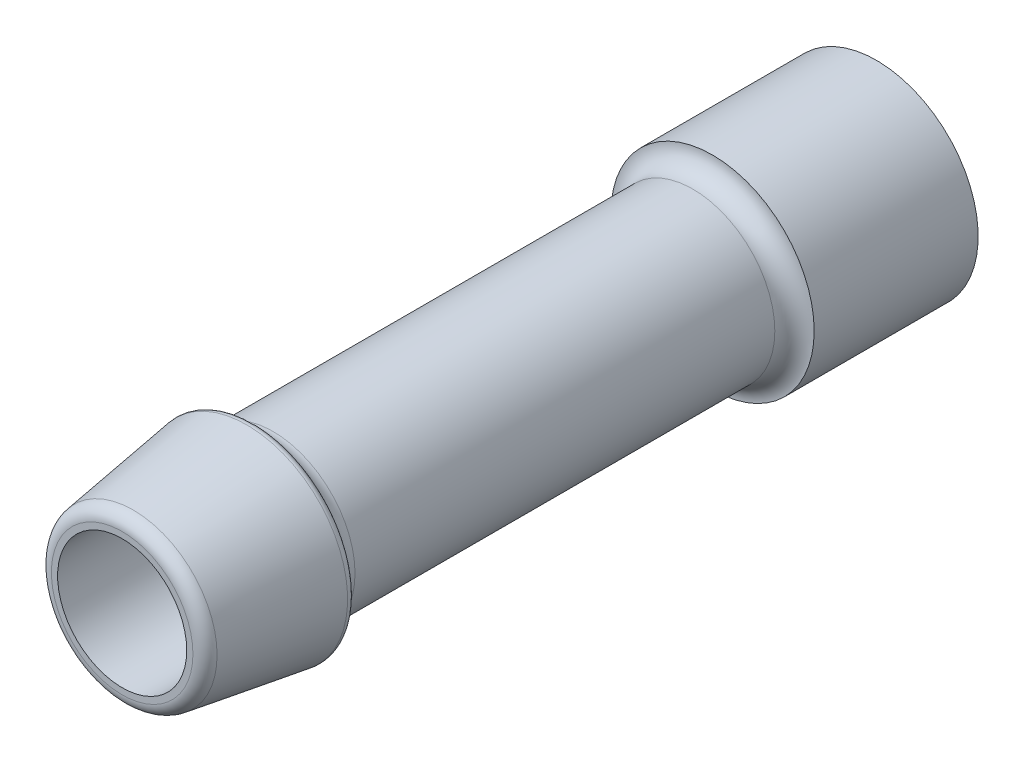
ISO-10303-21;
HEADER;
FILE_DESCRIPTION(('STEP AP214'),'2;1');
FILE_NAME('part.step','',(''),(''),'','','');
FILE_SCHEMA(('AUTOMOTIVE_DESIGN { 1 0 10303 214 1 1 1 1 }'));
ENDSEC;
DATA;
#1=APPLICATION_CONTEXT('core data for automotive mechanical design processes');
#2=APPLICATION_PROTOCOL_DEFINITION('international standard','automotive_design',2000,#1);
#3=PRODUCT_CONTEXT('',#1,'mechanical');
#4=PRODUCT('Part','Part','',(#3));
#5=PRODUCT_RELATED_PRODUCT_CATEGORY('part','',(#4));
#6=PRODUCT_DEFINITION_FORMATION('','',#4);
#7=PRODUCT_DEFINITION_CONTEXT('part definition',#1,'design');
#8=PRODUCT_DEFINITION('design','',#6,#7);
#9=PRODUCT_DEFINITION_SHAPE('','',#8);
#10=(LENGTH_UNIT() NAMED_UNIT(*) SI_UNIT(.MILLI.,.METRE.));
#11=(NAMED_UNIT(*) PLANE_ANGLE_UNIT() SI_UNIT($,.RADIAN.));
#12=(NAMED_UNIT(*) SI_UNIT($,.STERADIAN.) SOLID_ANGLE_UNIT());
#13=UNCERTAINTY_MEASURE_WITH_UNIT(LENGTH_MEASURE(1.E-05),#10,'distance_accuracy_value','');
#14=(GEOMETRIC_REPRESENTATION_CONTEXT(3) GLOBAL_UNCERTAINTY_ASSIGNED_CONTEXT((#13)) GLOBAL_UNIT_ASSIGNED_CONTEXT((#10,
#11,#12)) REPRESENTATION_CONTEXT('',''));
#15=CARTESIAN_POINT('',(0.,0.,0.));
#16=DIRECTION('',(0.,0.,1.));
#17=DIRECTION('',(1.,0.,0.));
#18=AXIS2_PLACEMENT_3D('',#15,#16,#17);
#19=CARTESIAN_POINT('',(0.,0.,29.21));
#20=DIRECTION('',(0.,0.,-1.));
#21=DIRECTION('',(-1.,0.,0.));
#22=AXIS2_PLACEMENT_3D('',#19,#20,#21);
#23=CYLINDRICAL_SURFACE('',#22,3.937);
#24=CARTESIAN_POINT('',(0.,0.,0.));
#25=DIRECTION('',(0.,0.,1.));
#26=DIRECTION('',(1.,0.,0.));
#27=AXIS2_PLACEMENT_3D('',#24,#25,#26);
#28=CIRCLE('',#27,3.937);
#29=CARTESIAN_POINT('',(-3.937,0.,0.));
#30=VERTEX_POINT('',#29);
#31=EDGE_CURVE('E71',#30,#30,#28,.T.);
#32=CARTESIAN_POINT('',(0.,0.,6.35));
#33=DIRECTION('',(0.,0.,1.));
#34=DIRECTION('',(1.,0.,0.));
#35=AXIS2_PLACEMENT_3D('',#32,#33,#34);
#36=CIRCLE('',#35,3.937);
#37=CARTESIAN_POINT('',(-3.937,0.,6.34999999999999));
#38=VERTEX_POINT('',#37);
#39=EDGE_CURVE('E72',#38,#38,#36,.T.);
#40=CARTESIAN_POINT('',(-3.937,0.,0.));
#41=CARTESIAN_POINT('',(-3.937,0.,0.066145833333333));
#42=CARTESIAN_POINT('',(-3.937,0.,0.132291666666666));
#43=CARTESIAN_POINT('',(-3.937,0.,0.264583333333332));
#44=CARTESIAN_POINT('',(-3.937,0.,0.330729166666665));
#45=CARTESIAN_POINT('',(-3.937,0.,0.463020833333332));
#46=CARTESIAN_POINT('',(-3.937,0.,0.529166666666666));
#47=CARTESIAN_POINT('',(-3.937,0.,0.661458333333333));
#48=CARTESIAN_POINT('',(-3.937,0.,0.727604166666666));
#49=CARTESIAN_POINT('',(-3.937,0.,0.859895833333332));
#50=CARTESIAN_POINT('',(-3.937,0.,0.926041666666665));
#51=CARTESIAN_POINT('',(-3.937,0.,1.05833333333333));
#52=CARTESIAN_POINT('',(-3.937,0.,1.12447916666667));
#53=CARTESIAN_POINT('',(-3.937,0.,1.25677083333333));
#54=CARTESIAN_POINT('',(-3.937,0.,1.32291666666667));
#55=CARTESIAN_POINT('',(-3.937,0.,1.45520833333333));
#56=CARTESIAN_POINT('',(-3.937,0.,1.52135416666667));
#57=CARTESIAN_POINT('',(-3.937,0.,1.65364583333333));
#58=CARTESIAN_POINT('',(-3.937,0.,1.71979166666666));
#59=CARTESIAN_POINT('',(-3.937,0.,1.85208333333333));
#60=CARTESIAN_POINT('',(-3.937,0.,1.91822916666666));
#61=CARTESIAN_POINT('',(-3.937,0.,2.05052083333333));
#62=CARTESIAN_POINT('',(-3.937,0.,2.11666666666666));
#63=CARTESIAN_POINT('',(-3.937,0.,2.24895833333333));
#64=CARTESIAN_POINT('',(-3.937,0.,2.31510416666667));
#65=CARTESIAN_POINT('',(-3.937,0.,2.44739583333333));
#66=CARTESIAN_POINT('',(-3.937,0.,2.51354166666666));
#67=CARTESIAN_POINT('',(-3.937,0.,2.64583333333333));
#68=CARTESIAN_POINT('',(-3.937,0.,2.71197916666667));
#69=CARTESIAN_POINT('',(-3.937,0.,2.84427083333333));
#70=CARTESIAN_POINT('',(-3.937,0.,2.91041666666667));
#71=CARTESIAN_POINT('',(-3.937,0.,3.04270833333333));
#72=CARTESIAN_POINT('',(-3.937,0.,3.10885416666666));
#73=CARTESIAN_POINT('',(-3.937,0.,3.24114583333333));
#74=CARTESIAN_POINT('',(-3.937,0.,3.30729166666666));
#75=CARTESIAN_POINT('',(-3.937,0.,3.43958333333333));
#76=CARTESIAN_POINT('',(-3.937,0.,3.50572916666666));
#77=CARTESIAN_POINT('',(-3.937,0.,3.63802083333333));
#78=CARTESIAN_POINT('',(-3.937,0.,3.70416666666666));
#79=CARTESIAN_POINT('',(-3.937,0.,3.83645833333333));
#80=CARTESIAN_POINT('',(-3.937,0.,3.90260416666666));
#81=CARTESIAN_POINT('',(-3.937,0.,4.03489583333333));
#82=CARTESIAN_POINT('',(-3.937,0.,4.10104166666666));
#83=CARTESIAN_POINT('',(-3.937,0.,4.23333333333333));
#84=CARTESIAN_POINT('',(-3.937,0.,4.29947916666666));
#85=CARTESIAN_POINT('',(-3.937,0.,4.43177083333333));
#86=CARTESIAN_POINT('',(-3.937,0.,4.49791666666666));
#87=CARTESIAN_POINT('',(-3.937,0.,4.63020833333333));
#88=CARTESIAN_POINT('',(-3.937,0.,4.69635416666666));
#89=CARTESIAN_POINT('',(-3.937,0.,4.82864583333333));
#90=CARTESIAN_POINT('',(-3.937,0.,4.89479166666666));
#91=CARTESIAN_POINT('',(-3.937,0.,5.02708333333333));
#92=CARTESIAN_POINT('',(-3.937,0.,5.09322916666666));
#93=CARTESIAN_POINT('',(-3.937,0.,5.22552083333333));
#94=CARTESIAN_POINT('',(-3.937,0.,5.29166666666666));
#95=CARTESIAN_POINT('',(-3.937,0.,5.42395833333333));
#96=CARTESIAN_POINT('',(-3.937,0.,5.49010416666666));
#97=CARTESIAN_POINT('',(-3.937,0.,5.62239583333333));
#98=CARTESIAN_POINT('',(-3.937,0.,5.68854166666666));
#99=CARTESIAN_POINT('',(-3.937,0.,5.82083333333333));
#100=CARTESIAN_POINT('',(-3.937,0.,5.88697916666666));
#101=CARTESIAN_POINT('',(-3.937,0.,6.01927083333333));
#102=CARTESIAN_POINT('',(-3.937,0.,6.08541666666666));
#103=CARTESIAN_POINT('',(-3.937,0.,6.21770833333333));
#104=CARTESIAN_POINT('',(-3.937,0.,6.28385416666666));
#105=CARTESIAN_POINT('',(-3.937,0.,6.34999999999999));
#106=B_SPLINE_CURVE_WITH_KNOTS('',3,(#40,#41,#42,#43,#44,#45,#46,#47,#48,#49,#50,#51,#52,#53,
#54,#55,#56,#57,#58,#59,#60,#61,#62,#63,#64,#65,#66,#67,#68,#69,#70,#71,#72,#73,#74,#75,#76,#77,
#78,#79,#80,#81,#82,#83,#84,#85,#86,#87,#88,#89,#90,#91,#92,#93,#94,#95,#96,#97,#98,#99,#100,
#101,#102,#103,#104,#105),.UNSPECIFIED.,.F.,.F.,(4,2,2,2,2,2,2,2,2,2,2,2,2,2,2,2,2,2,2,2,2,2,2,
2,2,2,2,2,2,2,2,2,4),(0.,0.198437499999999,0.396874999999998,0.5953125,0.793749999999999,
0.992187499999998,1.190625,1.3890625,1.5875,1.7859375,1.984375,2.1828125,2.38125,2.5796875,
2.778125,2.9765625,3.175,3.3734375,3.571875,3.7703125,3.96875,4.1671875,4.365625,4.5640625,
4.7625,4.96093749999999,5.15937499999999,5.3578125,5.55625,5.75468749999999,5.953125,6.1515625,
6.34999999999999),.UNSPECIFIED.);
#107=EDGE_CURVE('BSEAM39',#30,#38,#106,.T.);
#108=ORIENTED_EDGE('',*,*,#31,.T.);
#109=ORIENTED_EDGE('',*,*,#39,.F.);
#110=ORIENTED_EDGE('',*,*,#107,.T.);
#111=ORIENTED_EDGE('',*,*,#107,.F.);
#112=EDGE_LOOP('',(#108,#110,#109,#111));
#113=FACE_BOUND('',#112,.T.);
#114=ADVANCED_FACE('F39',(#113),#23,.T.);
#115=CARTESIAN_POINT('',(0.,0.,29.21));
#116=DIRECTION('',(0.,0.,1.));
#117=DIRECTION('',(1.,0.,0.));
#118=AXIS2_PLACEMENT_3D('',#115,#116,#117);
#119=PLANE('',#118);
#120=CARTESIAN_POINT('',(0.,0.,29.21));
#121=DIRECTION('',(0.,0.,1.));
#122=DIRECTION('',(1.,0.,0.));
#123=AXIS2_PLACEMENT_3D('',#120,#121,#122);
#124=CIRCLE('',#123,2.74006810887694);
#125=CARTESIAN_POINT('',(2.74006810887694,0.,29.21));
#126=VERTEX_POINT('',#125);
#127=EDGE_CURVE('E47',#126,#126,#124,.T.);
#128=ORIENTED_EDGE('',*,*,#127,.T.);
#129=EDGE_LOOP('',(#128));
#130=FACE_BOUND('',#129,.T.);
#131=CARTESIAN_POINT('',(0.,0.,29.21));
#132=DIRECTION('',(0.,0.,1.));
#133=DIRECTION('',(1.,0.,0.));
#134=AXIS2_PLACEMENT_3D('',#131,#132,#133);
#135=CIRCLE('',#134,2.5);
#136=CARTESIAN_POINT('',(2.5,0.,29.21));
#137=VERTEX_POINT('',#136);
#138=EDGE_CURVE('E76',#137,#137,#135,.T.);
#139=ORIENTED_EDGE('',*,*,#138,.F.);
#140=EDGE_LOOP('',(#139));
#141=FACE_BOUND('',#140,.T.);
#142=ADVANCED_FACE('F90',(#130,#141),#119,.T.);
#143=CARTESIAN_POINT('',(0.,0.,0.));
#144=DIRECTION('',(0.,0.,1.));
#145=DIRECTION('',(1.,0.,0.));
#146=AXIS2_PLACEMENT_3D('',#143,#144,#145);
#147=PLANE('',#146);
#148=CARTESIAN_POINT('',(0.,0.,0.));
#149=DIRECTION('',(0.,0.,1.));
#150=DIRECTION('',(1.,0.,0.));
#151=AXIS2_PLACEMENT_3D('',#148,#149,#150);
#152=CIRCLE('',#151,2.5);
#153=CARTESIAN_POINT('',(2.5,0.,0.));
#154=VERTEX_POINT('',#153);
#155=EDGE_CURVE('E80',#154,#154,#152,.T.);
#156=ORIENTED_EDGE('',*,*,#155,.T.);
#157=EDGE_LOOP('',(#156));
#158=FACE_BOUND('',#157,.T.);
#159=ORIENTED_EDGE('',*,*,#31,.F.);
#160=EDGE_LOOP('',(#159));
#161=FACE_BOUND('',#160,.T.);
#162=ADVANCED_FACE('F92',(#158,#161),#147,.F.);
#163=CARTESIAN_POINT('',(0.,0.,30.21));
#164=DIRECTION('',(0.,0.,-1.));
#165=DIRECTION('',(-1.,0.,0.));
#166=AXIS2_PLACEMENT_3D('',#163,#164,#165);
#167=CYLINDRICAL_SURFACE('',#166,2.5);
#168=ORIENTED_EDGE('',*,*,#155,.F.);
#169=EDGE_LOOP('',(#168));
#170=FACE_BOUND('',#169,.T.);
#171=ORIENTED_EDGE('',*,*,#138,.T.);
#172=EDGE_LOOP('',(#171));
#173=FACE_BOUND('',#172,.T.);
#174=ADVANCED_FACE('F88',(#170,#173),#167,.F.);
#175=CARTESIAN_POINT('',(0.,0.,6.35));
#176=DIRECTION('',(0.,0.,1.));
#177=DIRECTION('',(1.,0.,0.));
#178=AXIS2_PLACEMENT_3D('',#175,#176,#177);
#179=CYLINDRICAL_SURFACE('',#178,3.175);
#180=CARTESIAN_POINT('',(0.,0.,23.368));
#181=DIRECTION('',(0.,0.,1.));
#182=DIRECTION('',(1.,0.,0.));
#183=AXIS2_PLACEMENT_3D('',#180,#181,#182);
#184=CIRCLE('',#183,3.175);
#185=CARTESIAN_POINT('',(3.175,0.,23.368));
#186=VERTEX_POINT('',#185);
#187=EDGE_CURVE('E63',#186,#186,#184,.F.);
#188=ORIENTED_EDGE('',*,*,#187,.T.);
#189=EDGE_LOOP('',(#188));
#190=FACE_BOUND('',#189,.T.);
#191=CARTESIAN_POINT('',(0.,0.,7.112));
#192=DIRECTION('',(0.,0.,1.));
#193=DIRECTION('',(1.,0.,0.));
#194=AXIS2_PLACEMENT_3D('',#191,#192,#193);
#195=CIRCLE('',#194,3.175);
#196=CARTESIAN_POINT('',(3.175,0.,7.112));
#197=VERTEX_POINT('',#196);
#198=EDGE_CURVE('E67',#197,#197,#195,.T.);
#199=ORIENTED_EDGE('',*,*,#198,.T.);
#200=EDGE_LOOP('',(#199));
#201=FACE_BOUND('',#200,.T.);
#202=ADVANCED_FACE('F109',(#190,#201),#179,.T.);
#203=CARTESIAN_POINT('',(0.,0.,7.112));
#204=DIRECTION('',(0.,0.,1.));
#205=DIRECTION('',(1.,0.,0.));
#206=AXIS2_PLACEMENT_3D('',#203,#204,#205);
#207=TOROIDAL_SURFACE('',#206,3.937,0.762);
#208=ORIENTED_EDGE('',*,*,#39,.T.);
#209=EDGE_LOOP('',(#208));
#210=FACE_BOUND('',#209,.T.);
#211=ORIENTED_EDGE('',*,*,#198,.F.);
#212=EDGE_LOOP('',(#211));
#213=FACE_BOUND('',#212,.T.);
#214=ADVANCED_FACE('F105',(#210,#213),#207,.F.);
#215=CARTESIAN_POINT('',(0.,0.,23.368));
#216=DIRECTION('',(0.,0.,1.));
#217=DIRECTION('',(1.,0.,0.));
#218=AXIS2_PLACEMENT_3D('',#215,#216,#217);
#219=TOROIDAL_SURFACE('',#218,3.937,0.762);
#220=CARTESIAN_POINT('',(0.,0.,24.0986272288299));
#221=DIRECTION('',(0.,0.,-1.));
#222=DIRECTION('',(-1.,0.,0.));
#223=AXIS2_PLACEMENT_3D('',#220,#221,#222);
#224=CIRCLE('',#223,3.72060255895142);
#225=CARTESIAN_POINT('',(-3.72060255895142,0.,24.0986272288299));
#226=VERTEX_POINT('',#225);
#227=EDGE_CURVE('E52',#226,#226,#224,.T.);
#228=ORIENTED_EDGE('',*,*,#227,.T.);
#229=EDGE_LOOP('',(#228));
#230=FACE_BOUND('',#229,.T.);
#231=ORIENTED_EDGE('',*,*,#187,.F.);
#232=EDGE_LOOP('',(#231));
#233=FACE_BOUND('',#232,.T.);
#234=ADVANCED_FACE('F108',(#230,#233),#219,.F.);
#235=CARTESIAN_POINT('',(0.,0.,29.21));
#236=DIRECTION('',(0.,0.,-1.));
#237=DIRECTION('',(-1.,0.,0.));
#238=AXIS2_PLACEMENT_3D('',#235,#236,#237);
#239=CONICAL_SURFACE('',#238,3.17778891314653,0.148352986419515);
#240=CARTESIAN_POINT('',(0.,0.,28.7770871808538));
#241=DIRECTION('',(0.,0.,1.));
#242=DIRECTION('',(1.,0.,0.));
#243=AXIS2_PLACEMENT_3D('',#240,#241,#242);
#244=CIRCLE('',#243,3.24248816746479);
#245=CARTESIAN_POINT('',(3.24248816746479,0.,28.7770871808538));
#246=VERTEX_POINT('',#245);
#247=EDGE_CURVE('E10',#246,#246,#244,.F.);
#248=ORIENTED_EDGE('',*,*,#247,.T.);
#249=EDGE_LOOP('',(#248));
#250=FACE_BOUND('',#249,.T.);
#251=CARTESIAN_POINT('',(0.,0.,24.3797132288668));
#252=DIRECTION('',(0.,0.,-1.));
#253=DIRECTION('',(-1.,0.,0.));
#254=AXIS2_PLACEMENT_3D('',#251,#252,#253);
#255=CIRCLE('',#254,3.89968010789582);
#256=CARTESIAN_POINT('',(-3.89968010789582,0.,24.3797132288668));
#257=VERTEX_POINT('',#256);
#258=EDGE_CURVE('E57',#257,#257,#255,.F.);
#259=ORIENTED_EDGE('',*,*,#258,.T.);
#260=EDGE_LOOP('',(#259));
#261=FACE_BOUND('',#260,.T.);
#262=ADVANCED_FACE('F113',(#250,#261),#239,.T.);
#263=CARTESIAN_POINT('',(0.,0.,24.3421696384398));
#264=DIRECTION('',(0.,0.,-1.));
#265=DIRECTION('',(-1.,0.,0.));
#266=AXIS2_PLACEMENT_3D('',#263,#264,#265);
#267=TOROIDAL_SURFACE('',#266,3.64847007860189,0.254);
#268=ORIENTED_EDGE('',*,*,#227,.F.);
#269=EDGE_LOOP('',(#268));
#270=FACE_BOUND('',#269,.T.);
#271=ORIENTED_EDGE('',*,*,#258,.F.);
#272=EDGE_LOOP('',(#271));
#273=FACE_BOUND('',#272,.T.);
#274=ADVANCED_FACE('F119',(#270,#273),#267,.T.);
#275=CARTESIAN_POINT('',(0.,0.,28.702));
#276=DIRECTION('',(0.,0.,1.));
#277=DIRECTION('',(1.,0.,0.));
#278=AXIS2_PLACEMENT_3D('',#275,#276,#277);
#279=TOROIDAL_SURFACE('',#278,2.74006810887694,0.508);
#280=ORIENTED_EDGE('',*,*,#247,.F.);
#281=EDGE_LOOP('',(#280));
#282=FACE_BOUND('',#281,.T.);
#283=ORIENTED_EDGE('',*,*,#127,.F.);
#284=EDGE_LOOP('',(#283));
#285=FACE_BOUND('',#284,.T.);
#286=ADVANCED_FACE('F41',(#282,#285),#279,.T.);
#287=CLOSED_SHELL('',(#114,#142,#162,#174,#202,#214,#234,#262,#274,#286));
#288=MANIFOLD_SOLID_BREP('B2',#287);
#289=ADVANCED_BREP_SHAPE_REPRESENTATION('',(#18,#288),#14);
#290=SHAPE_DEFINITION_REPRESENTATION(#9,#289);
ENDSEC;
END-ISO-10303-21;
